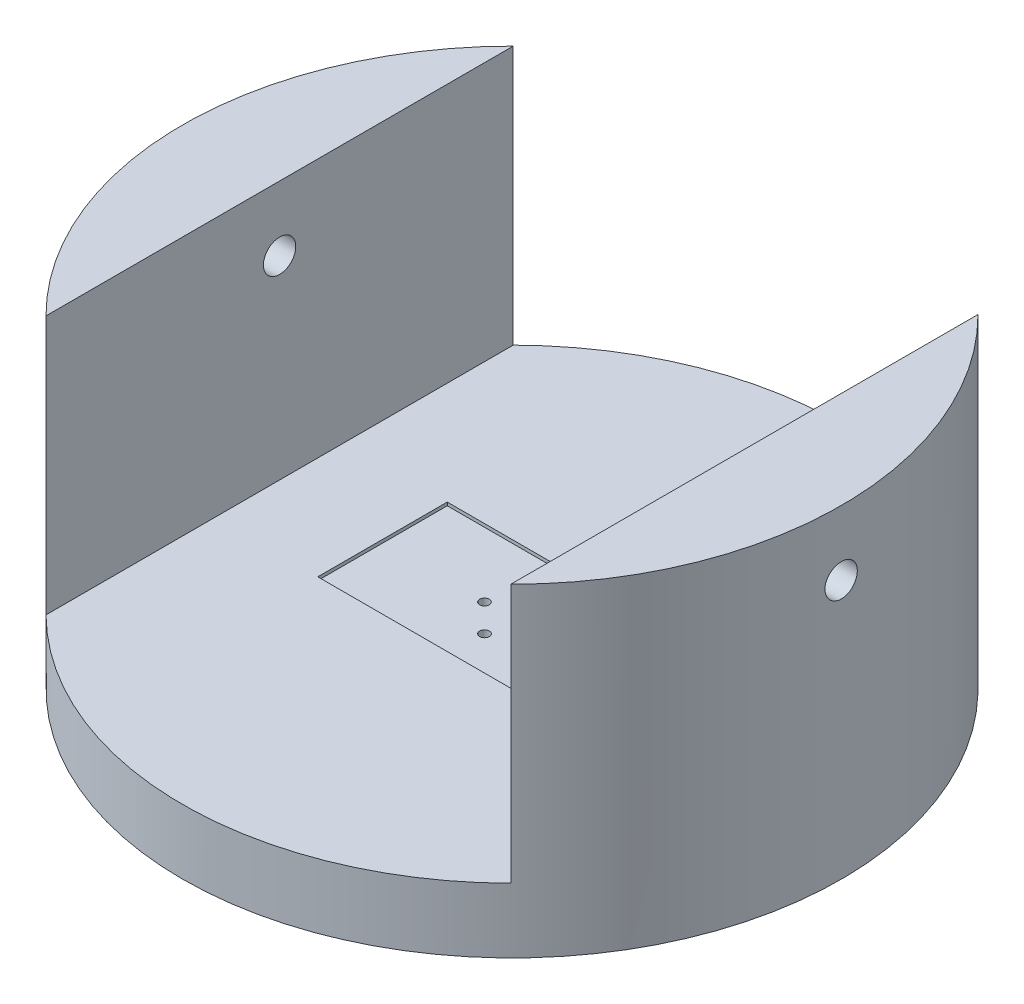
ISO-10303-21;
HEADER;
FILE_DESCRIPTION(('STEP AP214'),'2;1');
FILE_NAME('part.step','',(''),(''),'','','');
FILE_SCHEMA(('AUTOMOTIVE_DESIGN { 1 0 10303 214 1 1 1 1 }'));
ENDSEC;
DATA;
#1=APPLICATION_CONTEXT('core data for automotive mechanical design processes');
#2=APPLICATION_PROTOCOL_DEFINITION('international standard','automotive_design',2000,#1);
#3=PRODUCT_CONTEXT('',#1,'mechanical');
#4=PRODUCT('Part','Part','',(#3));
#5=PRODUCT_RELATED_PRODUCT_CATEGORY('part','',(#4));
#6=PRODUCT_DEFINITION_FORMATION('','',#4);
#7=PRODUCT_DEFINITION_CONTEXT('part definition',#1,'design');
#8=PRODUCT_DEFINITION('design','',#6,#7);
#9=PRODUCT_DEFINITION_SHAPE('','',#8);
#10=(LENGTH_UNIT() NAMED_UNIT(*) SI_UNIT(.MILLI.,.METRE.));
#11=(NAMED_UNIT(*) PLANE_ANGLE_UNIT() SI_UNIT($,.RADIAN.));
#12=(NAMED_UNIT(*) SI_UNIT($,.STERADIAN.) SOLID_ANGLE_UNIT());
#13=UNCERTAINTY_MEASURE_WITH_UNIT(LENGTH_MEASURE(1.E-05),#10,'distance_accuracy_value','');
#14=(GEOMETRIC_REPRESENTATION_CONTEXT(3) GLOBAL_UNCERTAINTY_ASSIGNED_CONTEXT((#13)) GLOBAL_UNIT_ASSIGNED_CONTEXT((#10,
#11,#12)) REPRESENTATION_CONTEXT('',''));
#15=CARTESIAN_POINT('',(0.,0.,0.));
#16=DIRECTION('',(0.,0.,1.));
#17=DIRECTION('',(1.,0.,0.));
#18=AXIS2_PLACEMENT_3D('',#15,#16,#17);
#19=CARTESIAN_POINT('',(0.,10.,0.));
#20=DIRECTION('',(0.,1.,0.));
#21=DIRECTION('',(0.,0.,1.));
#22=AXIS2_PLACEMENT_3D('',#19,#20,#21);
#23=PLANE('',#22);
#24=DIRECTION('',(0.,0.,1.));
#25=VECTOR('',#24,1.);
#26=CARTESIAN_POINT('',(-20.,10.,10.));
#27=LINE('',#26,#25);
#28=CARTESIAN_POINT('',(-20.,10.,-9.99999999999999));
#29=VERTEX_POINT('',#28);
#30=CARTESIAN_POINT('',(-20.,10.,10.));
#31=VERTEX_POINT('',#30);
#32=EDGE_CURVE('E62',#29,#31,#27,.T.);
#33=ORIENTED_EDGE('',*,*,#32,.F.);
#34=DIRECTION('',(-1.,0.,0.));
#35=VECTOR('',#34,1.);
#36=CARTESIAN_POINT('',(-20.,10.,-9.99999999999999));
#37=LINE('',#36,#35);
#38=CARTESIAN_POINT('',(20.,10.,-10.));
#39=VERTEX_POINT('',#38);
#40=EDGE_CURVE('E132',#39,#29,#37,.T.);
#41=ORIENTED_EDGE('',*,*,#40,.F.);
#42=DIRECTION('',(0.,0.,-1.));
#43=VECTOR('',#42,1.);
#44=CARTESIAN_POINT('',(20.,10.,-10.));
#45=LINE('',#44,#43);
#46=CARTESIAN_POINT('',(20.,10.,10.));
#47=VERTEX_POINT('',#46);
#48=EDGE_CURVE('E135',#47,#39,#45,.T.);
#49=ORIENTED_EDGE('',*,*,#48,.F.);
#50=DIRECTION('',(1.,0.,0.));
#51=VECTOR('',#50,1.);
#52=CARTESIAN_POINT('',(20.,10.,10.));
#53=LINE('',#52,#51);
#54=EDGE_CURVE('E148',#31,#47,#53,.T.);
#55=ORIENTED_EDGE('',*,*,#54,.F.);
#56=EDGE_LOOP('',(#33,#41,#49,#55));
#57=FACE_BOUND('',#56,.T.);
#58=CARTESIAN_POINT('',(0.,10.,0.));
#59=DIRECTION('',(0.,1.,0.));
#60=DIRECTION('',(0.,0.,1.));
#61=AXIS2_PLACEMENT_3D('',#58,#59,#60);
#62=CIRCLE('',#61,50.9);
#63=CARTESIAN_POINT('',(-35.9,10.,36.0832371053374));
#64=VERTEX_POINT('',#63);
#65=CARTESIAN_POINT('',(35.9,10.,36.0832371053374));
#66=VERTEX_POINT('',#65);
#67=EDGE_CURVE('E13',#64,#66,#62,.T.);
#68=ORIENTED_EDGE('',*,*,#67,.T.);
#69=DIRECTION('',(0.,0.,1.));
#70=VECTOR('',#69,1.);
#71=CARTESIAN_POINT('',(35.9,10.,-36.0832371053374));
#72=LINE('',#71,#70);
#73=CARTESIAN_POINT('',(35.9,10.,-36.0832371053374));
#74=VERTEX_POINT('',#73);
#75=EDGE_CURVE('E154',#74,#66,#72,.T.);
#76=ORIENTED_EDGE('',*,*,#75,.F.);
#77=CARTESIAN_POINT('',(-35.9,10.,-36.0832371053374));
#78=VERTEX_POINT('',#77);
#79=EDGE_CURVE('E54',#74,#78,#62,.T.);
#80=ORIENTED_EDGE('',*,*,#79,.T.);
#81=DIRECTION('',(0.,0.,-1.));
#82=VECTOR('',#81,1.);
#83=CARTESIAN_POINT('',(-35.9,10.,-36.0832371053374));
#84=LINE('',#83,#82);
#85=EDGE_CURVE('E168',#64,#78,#84,.T.);
#86=ORIENTED_EDGE('',*,*,#85,.F.);
#87=EDGE_LOOP('',(#68,#76,#80,#86));
#88=FACE_BOUND('',#87,.T.);
#89=ADVANCED_FACE('F44',(#57,#88),#23,.T.);
#90=CARTESIAN_POINT('',(0.,10.,0.));
#91=DIRECTION('',(0.,-1.,0.));
#92=DIRECTION('',(0.,0.,-1.));
#93=AXIS2_PLACEMENT_3D('',#90,#91,#92);
#94=CYLINDRICAL_SURFACE('',#93,50.9);
#95=CARTESIAN_POINT('',(50.9,37.5,0.));
#96=CARTESIAN_POINT('',(50.899999178288,37.5000061945284,0.140335315495875));
#97=CARTESIAN_POINT('',(50.8994134103271,37.5118560858074,0.280770230896745));
#98=CARTESIAN_POINT('',(50.8971329790787,37.5589597267073,0.55776618629829));
#99=CARTESIAN_POINT('',(50.8954370083023,37.5942410723297,0.694322460313293));
#100=CARTESIAN_POINT('',(50.8911281328147,37.6871952437949,0.959508478775688));
#101=CARTESIAN_POINT('',(50.8885156944419,37.7448566832624,1.08814221549268));
#102=CARTESIAN_POINT('',(50.8826681323159,37.8809168126421,1.33386985928264));
#103=CARTESIAN_POINT('',(50.8794331558784,37.9593105981527,1.45096648657076));
#104=CARTESIAN_POINT('',(50.8727009075915,38.1346957463511,1.67044562588503));
#105=CARTESIAN_POINT('',(50.869203413466,38.2317029798617,1.77281544976852));
#106=CARTESIAN_POINT('',(50.8623422368996,38.4415297624789,1.95982699405444));
#107=CARTESIAN_POINT('',(50.8589785599217,38.5543499562992,2.04446799127993));
#108=CARTESIAN_POINT('',(50.8527627656031,38.7926661665364,2.19365382762955));
#109=CARTESIAN_POINT('',(50.8499108992598,38.9181683554388,2.25818881790982));
#110=CARTESIAN_POINT('',(50.8450430142678,39.1782425471843,2.3652675243034));
#111=CARTESIAN_POINT('',(50.8430269894405,39.3128144829744,2.4078114029776));
#112=CARTESIAN_POINT('',(50.8400601281682,39.5870919771377,2.46966686111038));
#113=CARTESIAN_POINT('',(50.8391084252888,39.7267932640119,2.48899733889038));
#114=CARTESIAN_POINT('',(50.8383749272649,40.0074608495558,2.50393557912965));
#115=CARTESIAN_POINT('',(50.8385931231381,40.1484271385046,2.49954352372603));
#116=CARTESIAN_POINT('',(50.8401740116277,40.4274947746536,2.46717712116047));
#117=CARTESIAN_POINT('',(50.8415357133089,40.5655984963448,2.43922319208578));
#118=CARTESIAN_POINT('',(50.845248574059,40.8351508309038,2.3605581906664));
#119=CARTESIAN_POINT('',(50.8475997371996,40.9665994163822,2.30984702467215));
#120=CARTESIAN_POINT('',(50.853027663969,41.2191759176723,2.18708372784072));
#121=CARTESIAN_POINT('',(50.8561047440765,41.3402993005486,2.11502228537973));
#122=CARTESIAN_POINT('',(50.8626373612956,41.5687375641775,1.95161078383966));
#123=CARTESIAN_POINT('',(50.8660929009789,41.6760523510769,1.86026059367175));
#124=CARTESIAN_POINT('',(50.872997365203,41.8739459942041,1.66074945604258));
#125=CARTESIAN_POINT('',(50.8764462788778,41.9645070248656,1.55257082620293));
#126=CARTESIAN_POINT('',(50.8829452392278,42.1261851079459,1.32253575870044));
#127=CARTESIAN_POINT('',(50.8859952858071,42.1973021556894,1.20067931774873));
#128=CARTESIAN_POINT('',(50.8913528911502,42.3180717972252,0.946737284903343));
#129=CARTESIAN_POINT('',(50.8936604285125,42.3677237723377,0.814651398299533));
#130=CARTESIAN_POINT('',(50.8972726357233,42.4441421947544,0.544004523833167));
#131=CARTESIAN_POINT('',(50.8985773128176,42.4709088074095,0.405443582761672));
#132=CARTESIAN_POINT('',(50.9000358273666,42.5007747359253,0.125934593530665));
#133=CARTESIAN_POINT('',(50.9001908637601,42.5038987083246,-0.0150108140672829));
#134=CARTESIAN_POINT('',(50.8993358066533,42.4864550186276,-0.29542384877766));
#135=CARTESIAN_POINT('',(50.898325716869,42.4658874320928,-0.434891480601854));
#136=CARTESIAN_POINT('',(50.895254952083,42.401664870367,-0.708320917544246));
#137=CARTESIAN_POINT('',(50.8931947892422,42.3580211499043,-0.842285372384912));
#138=CARTESIAN_POINT('',(50.8882558356329,42.2488966157225,-1.10098730553627));
#139=CARTESIAN_POINT('',(50.8853770403188,42.1834156807464,-1.22572473260674));
#140=CARTESIAN_POINT('',(50.8791217098731,42.0324123335539,-1.4625450022472));
#141=CARTESIAN_POINT('',(50.8757447650221,41.9468733894934,-1.57461729266301));
#142=CARTESIAN_POINT('',(50.8688748257634,41.7582063209029,-1.78281987571597));
#143=CARTESIAN_POINT('',(50.8653818306358,41.6550780872696,-1.87895006945982));
#144=CARTESIAN_POINT('',(50.8586700744663,41.4340538232755,-2.05262265061835));
#145=CARTESIAN_POINT('',(50.8554515502621,41.3161452515169,-2.13014908762406));
#146=CARTESIAN_POINT('',(50.8496553919378,41.0689706998522,-2.26430445047674));
#147=CARTESIAN_POINT('',(50.8470777551016,40.939704768082,-2.32093346488818));
#148=CARTESIAN_POINT('',(50.8428557273101,40.673544026864,-2.41165867153619));
#149=CARTESIAN_POINT('',(50.8412109149174,40.5366526932185,-2.44576504034771));
#150=CARTESIAN_POINT('',(50.8390388284904,40.2590783228745,-2.49051008873807));
#151=CARTESIAN_POINT('',(50.8385115484061,40.1183953067072,-2.50114889536393));
#152=CARTESIAN_POINT('',(50.8386341379905,39.837389844152,-2.49865560768928));
#153=CARTESIAN_POINT('',(50.839282764967,39.6970671738715,-2.48554860783768));
#154=CARTESIAN_POINT('',(50.8416814372834,39.4206170817802,-2.43598762867176));
#155=CARTESIAN_POINT('',(50.8434314847278,39.2844896679865,-2.3995336047442));
#156=CARTESIAN_POINT('',(50.8478354746989,39.0202888675269,-2.30431845355329));
#157=CARTESIAN_POINT('',(50.8504894245008,38.8922155456951,-2.24555714674687));
#158=CARTESIAN_POINT('',(50.8564020098357,38.6477508769463,-2.10739987099319));
#159=CARTESIAN_POINT('',(50.8596606266338,38.531359168259,-2.02800454133867));
#160=CARTESIAN_POINT('',(50.8664191865589,38.3134365254526,-1.85074342741113));
#161=CARTESIAN_POINT('',(50.8699193553641,38.2119197730126,-1.75286021778541));
#162=CARTESIAN_POINT('',(50.876764964404,38.0267280661803,-1.54141207242487));
#163=CARTESIAN_POINT('',(50.8801103663485,37.9430575087482,-1.42784328339318));
#164=CARTESIAN_POINT('',(50.8862717104554,37.7958955493829,-1.18816111126337));
#165=CARTESIAN_POINT('',(50.889087151443,37.7324232097777,-1.06203602447497));
#166=CARTESIAN_POINT('',(50.8938637623272,37.6276310338376,-0.801000061070533));
#167=CARTESIAN_POINT('',(50.8958259412625,37.5862850182393,-0.666099780022183));
#168=CARTESIAN_POINT('',(50.8981556403198,37.5377704442036,-0.4419671524549));
#169=CARTESIAN_POINT('',(50.8988442377462,37.5236245962858,-0.354186725518144));
#170=CARTESIAN_POINT('',(50.8997666774609,37.504737417557,-0.177617500300308));
#171=CARTESIAN_POINT('',(50.9000005201229,37.4999960790203,-0.0888287028476507));
#172=CARTESIAN_POINT('',(50.9,37.5,0.));
#173=B_SPLINE_CURVE_WITH_KNOTS('',3,(#95,#96,#97,#98,#99,#100,#101,#102,#103,#104,#105,#106,
#107,#108,#109,#110,#111,#112,#113,#114,#115,#116,#117,#118,#119,#120,#121,#122,#123,#124,#125,
#126,#127,#128,#129,#130,#131,#132,#133,#134,#135,#136,#137,#138,#139,#140,#141,#142,#143,#144,
#145,#146,#147,#148,#149,#150,#151,#152,#153,#154,#155,#156,#157,#158,#159,#160,#161,#162,#163,
#164,#165,#166,#167,#168,#169,#170,#171,#172),.UNSPECIFIED.,.T.,.F.,(4,2,2,2,2,2,2,2,2,2,2,2,2,
2,2,2,2,2,2,2,2,2,2,2,2,2,2,2,2,2,2,2,2,2,2,2,2,2,4),(0.,0.420681689775843,0.841859711031153,
1.26282372881007,1.68368825313413,2.10491323668584,2.52615539909011,2.9476035819598,
3.36904864939046,3.79015037998689,4.21124887744889,4.63198283697985,5.0527185279122,
5.47363798761574,5.8945603080347,6.31592793517171,6.73729566362792,7.15867553619935,
7.58005236419971,8.00098968428222,8.42192566183705,8.84265652894807,9.26338973231761,
9.68447093115832,10.1055547419861,10.5269983001508,10.948440072193,11.3696912905263,
11.7909402283141,12.2117442519924,12.632549079777,13.0533572945356,13.4741524731757,
13.8953462604911,14.3166437023147,14.7383375778652,15.1595314073839,15.4258124883817,
15.692093350633),.UNSPECIFIED.);
#174=CARTESIAN_POINT('',(50.9,37.5,0.));
#175=VERTEX_POINT('',#174);
#176=EDGE_CURVE('E138',#175,#175,#173,.T.);
#177=ORIENTED_EDGE('',*,*,#176,.T.);
#178=EDGE_LOOP('',(#177));
#179=FACE_BOUND('',#178,.T.);
#180=CARTESIAN_POINT('',(-50.8385680364819,40.,2.5));
#181=CARTESIAN_POINT('',(-50.8385688619141,39.8596647996383,2.49999380536697));
#182=CARTESIAN_POINT('',(-50.8391553555019,39.719229998979,2.4881439328739));
#183=CARTESIAN_POINT('',(-50.8414383790576,39.4422342819935,2.44104037338173));
#184=CARTESIAN_POINT('',(-50.8431362178805,39.3056781317428,2.40575908999135));
#185=CARTESIAN_POINT('',(-50.8474491476851,39.0404923748944,2.31280510060348));
#186=CARTESIAN_POINT('',(-50.8500637720435,38.9118587749787,2.25514378395045));
#187=CARTESIAN_POINT('',(-50.8559150679424,38.6661313600612,2.11908394372054));
#188=CARTESIAN_POINT('',(-50.859151592327,38.5490348250178,2.0406903242404));
#189=CARTESIAN_POINT('',(-50.8658856296489,38.3295555801355,1.86530534316932));
#190=CARTESIAN_POINT('',(-50.8693833642523,38.2271855879932,1.76829807372093));
#191=CARTESIAN_POINT('',(-50.8762436010247,38.0401737193677,1.55847114877083));
#192=CARTESIAN_POINT('',(-50.8796060976767,37.9555325655461,1.44565084901232));
#193=CARTESIAN_POINT('',(-50.8858186224556,37.8063465665394,1.20733454735378));
#194=CARTESIAN_POINT('',(-50.8886683998857,37.7418115411318,1.08183239117292));
#195=CARTESIAN_POINT('',(-50.8935321196383,37.6347327607474,0.82175827058149));
#196=CARTESIAN_POINT('',(-50.8955460681232,37.5921888436357,0.687186373048127));
#197=CARTESIAN_POINT('',(-50.8985097024397,37.5303333035582,0.412908990337299));
#198=CARTESIAN_POINT('',(-50.8994602540816,37.5110027794651,0.273207777279604));
#199=CARTESIAN_POINT('',(-50.9001928786305,37.4960644210298,-0.00745966415324558));
#200=CARTESIAN_POINT('',(-50.8999749604847,37.5004564050393,-0.148425882833735));
#201=CARTESIAN_POINT('',(-50.8983959325729,37.5328226957588,-0.42749383702972));
#202=CARTESIAN_POINT('',(-50.8970358091285,37.5607766562165,-0.565597938655414));
#203=CARTESIAN_POINT('',(-50.8933267128996,37.6394418525637,-0.835151016920153));
#204=CARTESIAN_POINT('',(-50.8909777360761,37.6901531814035,-0.966599966374441));
#205=CARTESIAN_POINT('',(-50.8855538391901,37.8129168129539,-1.21917690425459));
#206=CARTESIAN_POINT('',(-50.8824786038039,37.8849783888869,-1.34030037843666));
#207=CARTESIAN_POINT('',(-50.875948522678,38.0483901739832,-1.56873876783677));
#208=CARTESIAN_POINT('',(-50.8724936743568,38.1397405143188,-1.67605358914184));
#209=CARTESIAN_POINT('',(-50.8655891435577,38.3392517570108,-1.87394705821838));
#210=CARTESIAN_POINT('',(-50.8621394703889,38.4474303114626,-1.96450791086828));
#211=CARTESIAN_POINT('',(-50.8556378649401,38.6774651652382,-2.12618567092248));
#212=CARTESIAN_POINT('',(-50.852585932763,38.7993214681021,-2.1973025732943));
#213=CARTESIAN_POINT('',(-50.8472242512466,39.0532634666557,-2.31807211077983));
#214=CARTESIAN_POINT('',(-50.8449145248713,39.1853494786963,-2.36772408178378));
#215=CARTESIAN_POINT('',(-50.8412986037421,39.455996625344,-2.44414245740849));
#216=CARTESIAN_POINT('',(-50.8399924017051,39.5945577129499,-2.47090902812242));
#217=CARTESIAN_POINT('',(-50.838532174105,39.8740667653657,-2.50077479894568));
#218=CARTESIAN_POINT('',(-50.8383769462724,40.0150120853414,-2.50389869548184));
#219=CARTESIAN_POINT('',(-50.8392330333581,40.2954249264732,-2.4864548853475));
#220=CARTESIAN_POINT('',(-50.8402443445563,40.4348924523406,-2.46588725423099));
#221=CARTESIAN_POINT('',(-50.8433184268664,40.7083213874026,-2.40166470965307));
#222=CARTESIAN_POINT('',(-50.84538068335,40.8422854568747,-2.35802109567891));
#223=CARTESIAN_POINT('',(-50.8503237813462,41.1009866665384,-2.24889690384843));
#224=CARTESIAN_POINT('',(-50.8532046274277,41.2257237552268,-2.18341620411296));
#225=CARTESIAN_POINT('',(-50.8594631303971,41.4625438020073,-2.0324131987815));
#226=CARTESIAN_POINT('',(-50.8628411977097,41.5746161697709,-1.94687430148595));
#227=CARTESIAN_POINT('',(-50.8697119525461,41.7828189307328,-1.75820728275871));
#228=CARTESIAN_POINT('',(-50.8732046407784,41.8789492253676,-1.65507905258713));
#229=CARTESIAN_POINT('',(-50.8799144876398,42.0526220135938,-1.43405474299083));
#230=CARTESIAN_POINT('',(-50.8831314083196,42.130148556443,-1.31614612186074));
#231=CARTESIAN_POINT('',(-50.8889237650071,42.264304105238,-1.06897144426609));
#232=CARTESIAN_POINT('',(-50.8914992037335,42.3209331997533,-0.939705435940266));
#233=CARTESIAN_POINT('',(-50.8957172030836,42.4116584618471,-0.673544751947019));
#234=CARTESIAN_POINT('',(-50.8973601864107,42.4457648406416,-0.536653563905589));
#235=CARTESIAN_POINT('',(-50.8995297901121,42.4905099583741,-0.259079499756969));
#236=CARTESIAN_POINT('',(-50.9000564164935,42.5011488235885,-0.118396644056491));
#237=CARTESIAN_POINT('',(-50.8999339827891,42.4986557021379,0.162608927886482));
#238=CARTESIAN_POINT('',(-50.8992861604046,42.4855487401911,0.302931867381018));
#239=CARTESIAN_POINT('',(-50.8968901987568,42.435987741906,0.579382507084282));
#240=CARTESIAN_POINT('',(-50.8951420574138,42.3995336614374,0.715510199362732));
#241=CARTESIAN_POINT('',(-50.8907421468803,42.3043182973011,0.979711541377468));
#242=CARTESIAN_POINT('',(-50.8880903704119,42.2455568339656,1.10778512623487));
#243=CARTESIAN_POINT('',(-50.8821814476901,42.1073991641146,1.35225025538102));
#244=CARTESIAN_POINT('',(-50.878924320201,42.028003597176,1.46864216160141));
#245=CARTESIAN_POINT('',(-50.8721674145165,41.8507422274803,1.68656478043904));
#246=CARTESIAN_POINT('',(-50.8686674100798,41.7528590532597,1.7880813551716));
#247=CARTESIAN_POINT('',(-50.8618207217253,41.5414110510904,1.97327272005739));
#248=CARTESIAN_POINT('',(-50.8584740757552,41.42784236946,2.05694311279274));
#249=CARTESIAN_POINT('',(-50.8523093735175,41.1881602795019,2.20410490082794));
#250=CARTESIAN_POINT('',(-50.849491818431,41.0620351483677,2.26757720262708));
#251=CARTESIAN_POINT('',(-50.8447110477833,40.8009990898838,2.3723692954851));
#252=CARTESIAN_POINT('',(-50.8427468230828,40.6660987583502,2.41371526639934));
#253=CARTESIAN_POINT('',(-50.8404145659926,40.4419662509278,2.46222971071387));
#254=CARTESIAN_POINT('',(-50.8397251687866,40.3541860037853,2.47637550035938));
#255=CARTESIAN_POINT('',(-50.8388016429805,40.1776171390258,2.49526260164446));
#256=CARTESIAN_POINT('',(-50.8385675140048,40.0888285222406,2.50000392104117));
#257=CARTESIAN_POINT('',(-50.8385680364819,40.,2.5));
#258=B_SPLINE_CURVE_WITH_KNOTS('',3,(#180,#181,#182,#183,#184,#185,#186,#187,#188,#189,#190,
#191,#192,#193,#194,#195,#196,#197,#198,#199,#200,#201,#202,#203,#204,#205,#206,#207,#208,#209,
#210,#211,#212,#213,#214,#215,#216,#217,#218,#219,#220,#221,#222,#223,#224,#225,#226,#227,#228,
#229,#230,#231,#232,#233,#234,#235,#236,#237,#238,#239,#240,#241,#242,#243,#244,#245,#246,#247,
#248,#249,#250,#251,#252,#253,#254,#255,#256,#257),.UNSPECIFIED.,.T.,.F.,(4,2,2,2,2,2,2,2,2,2,2,
2,2,2,2,2,2,2,2,2,2,2,2,2,2,2,2,2,2,2,2,2,2,2,2,2,2,2,4),(0.,0.420681344000615,
0.841859027018842,1.26282265042108,1.6836867864336,2.10491222230972,2.5261548248054,
2.94760283967315,3.3690477472653,3.79014926702614,4.21124756232848,4.63198260266036,
5.05271936145886,5.47363913076151,5.89456176259848,6.31592893964616,6.73729622575156,
7.15867654772907,7.58005381146897,8.00099085635381,8.42192655884392,8.84265633473323,
9.26338845887776,9.68446983873335,10.1055538218715,10.5269975600752,10.9484395120589,
11.3696902617579,11.7909387447428,12.2117435500623,12.6325491507805,13.0533581408129,
13.4741540889574,13.8953474134827,14.3166444032507,14.7383384751824,15.159532489674,
15.4258130297548,15.6920933501979),.UNSPECIFIED.);
#259=CARTESIAN_POINT('',(-50.8385680364819,40.,2.5));
#260=VERTEX_POINT('',#259);
#261=EDGE_CURVE('E212',#260,#260,#258,.T.);
#262=ORIENTED_EDGE('',*,*,#261,.T.);
#263=EDGE_LOOP('',(#262));
#264=FACE_BOUND('',#263,.T.);
#265=ORIENTED_EDGE('',*,*,#67,.F.);
#266=DIRECTION('',(0.,-1.,0.));
#267=VECTOR('',#266,1.);
#268=CARTESIAN_POINT('',(-35.9,50.,36.0832371053374));
#269=LINE('',#268,#267);
#270=CARTESIAN_POINT('',(-35.9,50.,36.0832371053374));
#271=VERTEX_POINT('',#270);
#272=EDGE_CURVE('E179',#271,#64,#269,.T.);
#273=ORIENTED_EDGE('',*,*,#272,.F.);
#274=CARTESIAN_POINT('',(0.,50.,0.));
#275=DIRECTION('',(0.,1.,0.));
#276=DIRECTION('',(0.,0.,1.));
#277=AXIS2_PLACEMENT_3D('',#274,#275,#276);
#278=CIRCLE('',#277,50.9);
#279=CARTESIAN_POINT('',(-35.9,50.,-36.0832371053374));
#280=VERTEX_POINT('',#279);
#281=EDGE_CURVE('E169',#280,#271,#278,.T.);
#282=ORIENTED_EDGE('',*,*,#281,.F.);
#283=DIRECTION('',(0.,-1.,0.));
#284=VECTOR('',#283,1.);
#285=CARTESIAN_POINT('',(-35.9,50.,-36.0832371053374));
#286=LINE('',#285,#284);
#287=EDGE_CURVE('E174',#280,#78,#286,.T.);
#288=ORIENTED_EDGE('',*,*,#287,.T.);
#289=ORIENTED_EDGE('',*,*,#79,.F.);
#290=DIRECTION('',(0.,-1.,0.));
#291=VECTOR('',#290,1.);
#292=CARTESIAN_POINT('',(35.9,50.,-36.0832371053374));
#293=LINE('',#292,#291);
#294=CARTESIAN_POINT('',(35.9,50.,-36.0832371053374));
#295=VERTEX_POINT('',#294);
#296=EDGE_CURVE('E70',#295,#74,#293,.T.);
#297=ORIENTED_EDGE('',*,*,#296,.F.);
#298=CARTESIAN_POINT('',(0.,50.,0.));
#299=DIRECTION('',(0.,1.,0.));
#300=DIRECTION('',(0.,0.,-1.));
#301=AXIS2_PLACEMENT_3D('',#298,#299,#300);
#302=CIRCLE('',#301,50.9);
#303=CARTESIAN_POINT('',(35.9,50.,36.0832371053374));
#304=VERTEX_POINT('',#303);
#305=EDGE_CURVE('E158',#304,#295,#302,.T.);
#306=ORIENTED_EDGE('',*,*,#305,.F.);
#307=DIRECTION('',(0.,-1.,0.));
#308=VECTOR('',#307,1.);
#309=CARTESIAN_POINT('',(35.9,50.,36.0832371053374));
#310=LINE('',#309,#308);
#311=EDGE_CURVE('E163',#304,#66,#310,.T.);
#312=ORIENTED_EDGE('',*,*,#311,.T.);
#313=EDGE_LOOP('',(#265,#273,#282,#288,#289,#297,#306,#312));
#314=FACE_BOUND('',#313,.T.);
#315=CARTESIAN_POINT('',(0.,0.,0.));
#316=DIRECTION('',(0.,1.,0.));
#317=DIRECTION('',(0.,0.,1.));
#318=AXIS2_PLACEMENT_3D('',#315,#316,#317);
#319=CIRCLE('',#318,50.9);
#320=CARTESIAN_POINT('',(0.,0.,50.9));
#321=VERTEX_POINT('',#320);
#322=EDGE_CURVE('E181',#321,#321,#319,.T.);
#323=ORIENTED_EDGE('',*,*,#322,.T.);
#324=EDGE_LOOP('',(#323));
#325=FACE_BOUND('',#324,.T.);
#326=ADVANCED_FACE('F46',(#179,#264,#314,#325),#94,.T.);
#327=CARTESIAN_POINT('',(0.,0.,0.));
#328=DIRECTION('',(0.,1.,0.));
#329=DIRECTION('',(0.,0.,1.));
#330=AXIS2_PLACEMENT_3D('',#327,#328,#329);
#331=PLANE('',#330);
#332=CARTESIAN_POINT('',(0.,0.,4.25));
#333=DIRECTION('',(0.,-1.,0.));
#334=DIRECTION('',(0.,0.,-1.));
#335=AXIS2_PLACEMENT_3D('',#332,#333,#334);
#336=CIRCLE('',#335,0.75);
#337=CARTESIAN_POINT('',(0.,0.,3.5));
#338=VERTEX_POINT('',#337);
#339=EDGE_CURVE('E196',#338,#338,#336,.T.);
#340=ORIENTED_EDGE('',*,*,#339,.F.);
#341=EDGE_LOOP('',(#340));
#342=FACE_BOUND('',#341,.T.);
#343=CARTESIAN_POINT('',(4.25,0.,0.));
#344=DIRECTION('',(0.,-1.,0.));
#345=DIRECTION('',(0.,0.,-1.));
#346=AXIS2_PLACEMENT_3D('',#343,#344,#345);
#347=CIRCLE('',#346,0.75);
#348=CARTESIAN_POINT('',(4.25,0.,-0.75));
#349=VERTEX_POINT('',#348);
#350=EDGE_CURVE('E272',#349,#349,#347,.T.);
#351=ORIENTED_EDGE('',*,*,#350,.F.);
#352=EDGE_LOOP('',(#351));
#353=FACE_BOUND('',#352,.T.);
#354=CARTESIAN_POINT('',(0.,0.,-4.25));
#355=DIRECTION('',(0.,-1.,0.));
#356=DIRECTION('',(0.,0.,-1.));
#357=AXIS2_PLACEMENT_3D('',#354,#355,#356);
#358=CIRCLE('',#357,0.75);
#359=CARTESIAN_POINT('',(0.,0.,-5.));
#360=VERTEX_POINT('',#359);
#361=EDGE_CURVE('E209',#360,#360,#358,.T.);
#362=ORIENTED_EDGE('',*,*,#361,.F.);
#363=EDGE_LOOP('',(#362));
#364=FACE_BOUND('',#363,.T.);
#365=CARTESIAN_POINT('',(-4.25,0.,0.));
#366=DIRECTION('',(0.,-1.,0.));
#367=DIRECTION('',(0.,0.,-1.));
#368=AXIS2_PLACEMENT_3D('',#365,#366,#367);
#369=CIRCLE('',#368,0.75);
#370=CARTESIAN_POINT('',(-4.25,0.,-0.75));
#371=VERTEX_POINT('',#370);
#372=EDGE_CURVE('E192',#371,#371,#369,.T.);
#373=ORIENTED_EDGE('',*,*,#372,.F.);
#374=EDGE_LOOP('',(#373));
#375=FACE_BOUND('',#374,.T.);
#376=ORIENTED_EDGE('',*,*,#322,.F.);
#377=EDGE_LOOP('',(#376));
#378=FACE_BOUND('',#377,.T.);
#379=ADVANCED_FACE('F256',(#342,#353,#364,#375,#378),#331,.F.);
#380=CARTESIAN_POINT('',(-35.9,50.,-36.0832371053374));
#381=DIRECTION('',(-1.,0.,0.));
#382=DIRECTION('',(0.,0.,1.));
#383=AXIS2_PLACEMENT_3D('',#380,#381,#382);
#384=PLANE('',#383);
#385=CARTESIAN_POINT('',(-35.9,40.,0.));
#386=DIRECTION('',(-1.,0.,0.));
#387=DIRECTION('',(0.,0.,1.));
#388=AXIS2_PLACEMENT_3D('',#385,#386,#387);
#389=CIRCLE('',#388,2.5);
#390=CARTESIAN_POINT('',(-35.9,40.,2.5));
#391=VERTEX_POINT('',#390);
#392=EDGE_CURVE('E188',#391,#391,#389,.T.);
#393=ORIENTED_EDGE('',*,*,#392,.T.);
#394=EDGE_LOOP('',(#393));
#395=FACE_BOUND('',#394,.T.);
#396=ORIENTED_EDGE('',*,*,#85,.T.);
#397=ORIENTED_EDGE('',*,*,#287,.F.);
#398=DIRECTION('',(0.,0.,-1.));
#399=VECTOR('',#398,1.);
#400=CARTESIAN_POINT('',(-35.9,50.,-36.0832371053374));
#401=LINE('',#400,#399);
#402=EDGE_CURVE('E172',#271,#280,#401,.T.);
#403=ORIENTED_EDGE('',*,*,#402,.F.);
#404=ORIENTED_EDGE('',*,*,#272,.T.);
#405=EDGE_LOOP('',(#396,#397,#403,#404));
#406=FACE_BOUND('',#405,.T.);
#407=ADVANCED_FACE('F252',(#395,#406),#384,.F.);
#408=CARTESIAN_POINT('',(0.,50.,0.));
#409=DIRECTION('',(0.,1.,0.));
#410=DIRECTION('',(0.,0.,1.));
#411=AXIS2_PLACEMENT_3D('',#408,#409,#410);
#412=PLANE('',#411);
#413=ORIENTED_EDGE('',*,*,#281,.T.);
#414=ORIENTED_EDGE('',*,*,#402,.T.);
#415=EDGE_LOOP('',(#413,#414));
#416=FACE_BOUND('',#415,.T.);
#417=ADVANCED_FACE('F248',(#416),#412,.T.);
#418=CARTESIAN_POINT('',(35.9,50.,-36.0832371053374));
#419=DIRECTION('',(1.,0.,0.));
#420=DIRECTION('',(0.,0.,-1.));
#421=AXIS2_PLACEMENT_3D('',#418,#419,#420);
#422=PLANE('',#421);
#423=CARTESIAN_POINT('',(35.9,40.,0.));
#424=DIRECTION('',(1.,0.,0.));
#425=DIRECTION('',(0.,0.,-1.));
#426=AXIS2_PLACEMENT_3D('',#423,#424,#425);
#427=CIRCLE('',#426,2.5);
#428=CARTESIAN_POINT('',(35.9,40.,-2.5));
#429=VERTEX_POINT('',#428);
#430=EDGE_CURVE('E185',#429,#429,#427,.T.);
#431=ORIENTED_EDGE('',*,*,#430,.T.);
#432=EDGE_LOOP('',(#431));
#433=FACE_BOUND('',#432,.T.);
#434=ORIENTED_EDGE('',*,*,#75,.T.);
#435=ORIENTED_EDGE('',*,*,#311,.F.);
#436=DIRECTION('',(0.,0.,1.));
#437=VECTOR('',#436,1.);
#438=CARTESIAN_POINT('',(35.9,50.,-36.0832371053374));
#439=LINE('',#438,#437);
#440=EDGE_CURVE('E161',#295,#304,#439,.T.);
#441=ORIENTED_EDGE('',*,*,#440,.F.);
#442=ORIENTED_EDGE('',*,*,#296,.T.);
#443=EDGE_LOOP('',(#434,#435,#441,#442));
#444=FACE_BOUND('',#443,.T.);
#445=ADVANCED_FACE('F244',(#433,#444),#422,.F.);
#446=CARTESIAN_POINT('',(0.,50.,0.));
#447=DIRECTION('',(0.,-1.,0.));
#448=DIRECTION('',(0.,0.,-1.));
#449=AXIS2_PLACEMENT_3D('',#446,#447,#448);
#450=PLANE('',#449);
#451=ORIENTED_EDGE('',*,*,#305,.T.);
#452=ORIENTED_EDGE('',*,*,#440,.T.);
#453=EDGE_LOOP('',(#451,#452));
#454=FACE_BOUND('',#453,.T.);
#455=ADVANCED_FACE('F241',(#454),#450,.F.);
#456=CARTESIAN_POINT('',(-20.,9.5,10.));
#457=DIRECTION('',(-1.,0.,0.));
#458=DIRECTION('',(0.,0.,1.));
#459=AXIS2_PLACEMENT_3D('',#456,#457,#458);
#460=PLANE('',#459);
#461=ORIENTED_EDGE('',*,*,#32,.T.);
#462=DIRECTION('',(0.,1.,0.));
#463=VECTOR('',#462,1.);
#464=CARTESIAN_POINT('',(-20.,9.5,10.));
#465=LINE('',#464,#463);
#466=CARTESIAN_POINT('',(-20.,9.5,10.));
#467=VERTEX_POINT('',#466);
#468=EDGE_CURVE('E110',#467,#31,#465,.T.);
#469=ORIENTED_EDGE('',*,*,#468,.F.);
#470=DIRECTION('',(0.,0.,1.));
#471=VECTOR('',#470,1.);
#472=CARTESIAN_POINT('',(-20.,9.5,10.));
#473=LINE('',#472,#471);
#474=CARTESIAN_POINT('',(-20.,9.5,-9.99999999999999));
#475=VERTEX_POINT('',#474);
#476=EDGE_CURVE('E114',#475,#467,#473,.T.);
#477=ORIENTED_EDGE('',*,*,#476,.F.);
#478=DIRECTION('',(0.,1.,0.));
#479=VECTOR('',#478,1.);
#480=CARTESIAN_POINT('',(-20.,9.5,-9.99999999999999));
#481=LINE('',#480,#479);
#482=EDGE_CURVE('E152',#475,#29,#481,.T.);
#483=ORIENTED_EDGE('',*,*,#482,.T.);
#484=EDGE_LOOP('',(#461,#469,#477,#483));
#485=FACE_BOUND('',#484,.T.);
#486=ADVANCED_FACE('F112',(#485),#460,.F.);
#487=CARTESIAN_POINT('',(-20.,9.5,-9.99999999999999));
#488=DIRECTION('',(0.,0.,-1.));
#489=DIRECTION('',(-1.,0.,0.));
#490=AXIS2_PLACEMENT_3D('',#487,#488,#489);
#491=PLANE('',#490);
#492=ORIENTED_EDGE('',*,*,#40,.T.);
#493=ORIENTED_EDGE('',*,*,#482,.F.);
#494=DIRECTION('',(-1.,0.,0.));
#495=VECTOR('',#494,1.);
#496=CARTESIAN_POINT('',(-20.,9.5,-9.99999999999999));
#497=LINE('',#496,#495);
#498=CARTESIAN_POINT('',(20.,9.5,-10.));
#499=VERTEX_POINT('',#498);
#500=EDGE_CURVE('E120',#499,#475,#497,.T.);
#501=ORIENTED_EDGE('',*,*,#500,.F.);
#502=DIRECTION('',(0.,1.,0.));
#503=VECTOR('',#502,1.);
#504=CARTESIAN_POINT('',(20.,9.5,-10.));
#505=LINE('',#504,#503);
#506=EDGE_CURVE('E155',#499,#39,#505,.T.);
#507=ORIENTED_EDGE('',*,*,#506,.T.);
#508=EDGE_LOOP('',(#492,#493,#501,#507));
#509=FACE_BOUND('',#508,.T.);
#510=ADVANCED_FACE('F229',(#509),#491,.F.);
#511=CARTESIAN_POINT('',(20.,9.5,-10.));
#512=DIRECTION('',(1.,0.,0.));
#513=DIRECTION('',(0.,0.,-1.));
#514=AXIS2_PLACEMENT_3D('',#511,#512,#513);
#515=PLANE('',#514);
#516=ORIENTED_EDGE('',*,*,#48,.T.);
#517=ORIENTED_EDGE('',*,*,#506,.F.);
#518=DIRECTION('',(0.,0.,-1.));
#519=VECTOR('',#518,1.);
#520=CARTESIAN_POINT('',(20.,9.5,-10.));
#521=LINE('',#520,#519);
#522=CARTESIAN_POINT('',(20.,9.5,10.));
#523=VERTEX_POINT('',#522);
#524=EDGE_CURVE('E128',#523,#499,#521,.T.);
#525=ORIENTED_EDGE('',*,*,#524,.F.);
#526=DIRECTION('',(0.,1.,0.));
#527=VECTOR('',#526,1.);
#528=CARTESIAN_POINT('',(20.,9.5,10.));
#529=LINE('',#528,#527);
#530=EDGE_CURVE('E119',#523,#47,#529,.T.);
#531=ORIENTED_EDGE('',*,*,#530,.T.);
#532=EDGE_LOOP('',(#516,#517,#525,#531));
#533=FACE_BOUND('',#532,.T.);
#534=ADVANCED_FACE('F232',(#533),#515,.F.);
#535=CARTESIAN_POINT('',(20.,9.5,10.));
#536=DIRECTION('',(0.,0.,1.));
#537=DIRECTION('',(1.,0.,0.));
#538=AXIS2_PLACEMENT_3D('',#535,#536,#537);
#539=PLANE('',#538);
#540=ORIENTED_EDGE('',*,*,#54,.T.);
#541=ORIENTED_EDGE('',*,*,#530,.F.);
#542=DIRECTION('',(1.,0.,0.));
#543=VECTOR('',#542,1.);
#544=CARTESIAN_POINT('',(20.,9.5,10.));
#545=LINE('',#544,#543);
#546=EDGE_CURVE('E123',#467,#523,#545,.T.);
#547=ORIENTED_EDGE('',*,*,#546,.F.);
#548=ORIENTED_EDGE('',*,*,#468,.T.);
#549=EDGE_LOOP('',(#540,#541,#547,#548));
#550=FACE_BOUND('',#549,.T.);
#551=ADVANCED_FACE('F124',(#550),#539,.F.);
#552=CARTESIAN_POINT('',(0.,9.5,0.));
#553=DIRECTION('',(0.,-1.,0.));
#554=DIRECTION('',(0.,0.,-1.));
#555=AXIS2_PLACEMENT_3D('',#552,#553,#554);
#556=PLANE('',#555);
#557=CARTESIAN_POINT('',(0.,9.5,4.25));
#558=DIRECTION('',(0.,-1.,0.));
#559=DIRECTION('',(0.,0.,-1.));
#560=AXIS2_PLACEMENT_3D('',#557,#558,#559);
#561=CIRCLE('',#560,0.75);
#562=CARTESIAN_POINT('',(0.,9.5,3.5));
#563=VERTEX_POINT('',#562);
#564=EDGE_CURVE('E49',#563,#563,#561,.T.);
#565=ORIENTED_EDGE('',*,*,#564,.T.);
#566=EDGE_LOOP('',(#565));
#567=FACE_BOUND('',#566,.T.);
#568=CARTESIAN_POINT('',(4.25,9.5,0.));
#569=DIRECTION('',(0.,-1.,0.));
#570=DIRECTION('',(0.,0.,-1.));
#571=AXIS2_PLACEMENT_3D('',#568,#569,#570);
#572=CIRCLE('',#571,0.75);
#573=CARTESIAN_POINT('',(4.25,9.5,-0.75));
#574=VERTEX_POINT('',#573);
#575=EDGE_CURVE('E195',#574,#574,#572,.T.);
#576=ORIENTED_EDGE('',*,*,#575,.T.);
#577=EDGE_LOOP('',(#576));
#578=FACE_BOUND('',#577,.T.);
#579=CARTESIAN_POINT('',(0.,9.5,-4.25));
#580=DIRECTION('',(0.,-1.,0.));
#581=DIRECTION('',(0.,0.,-1.));
#582=AXIS2_PLACEMENT_3D('',#579,#580,#581);
#583=CIRCLE('',#582,0.75);
#584=CARTESIAN_POINT('',(0.,9.5,-5.));
#585=VERTEX_POINT('',#584);
#586=EDGE_CURVE('E193',#585,#585,#583,.T.);
#587=ORIENTED_EDGE('',*,*,#586,.T.);
#588=EDGE_LOOP('',(#587));
#589=FACE_BOUND('',#588,.T.);
#590=CARTESIAN_POINT('',(-4.25,9.5,0.));
#591=DIRECTION('',(0.,-1.,0.));
#592=DIRECTION('',(0.,0.,-1.));
#593=AXIS2_PLACEMENT_3D('',#590,#591,#592);
#594=CIRCLE('',#593,0.75);
#595=CARTESIAN_POINT('',(-4.25,9.5,-0.75));
#596=VERTEX_POINT('',#595);
#597=EDGE_CURVE('E189',#596,#596,#594,.T.);
#598=ORIENTED_EDGE('',*,*,#597,.T.);
#599=EDGE_LOOP('',(#598));
#600=FACE_BOUND('',#599,.T.);
#601=ORIENTED_EDGE('',*,*,#476,.T.);
#602=ORIENTED_EDGE('',*,*,#546,.T.);
#603=ORIENTED_EDGE('',*,*,#524,.T.);
#604=ORIENTED_EDGE('',*,*,#500,.T.);
#605=EDGE_LOOP('',(#601,#602,#603,#604));
#606=FACE_BOUND('',#605,.T.);
#607=ADVANCED_FACE('F130',(#567,#578,#589,#600,#606),#556,.F.);
#608=CARTESIAN_POINT('',(50.9,40.,0.));
#609=DIRECTION('',(-1.,0.,0.));
#610=DIRECTION('',(0.,0.,1.));
#611=AXIS2_PLACEMENT_3D('',#608,#609,#610);
#612=CYLINDRICAL_SURFACE('',#611,2.5);
#613=ORIENTED_EDGE('',*,*,#430,.F.);
#614=EDGE_LOOP('',(#613));
#615=FACE_BOUND('',#614,.T.);
#616=ORIENTED_EDGE('',*,*,#176,.F.);
#617=EDGE_LOOP('',(#616));
#618=FACE_BOUND('',#617,.T.);
#619=ADVANCED_FACE('F217',(#615,#618),#612,.F.);
#620=ORIENTED_EDGE('',*,*,#392,.F.);
#621=EDGE_LOOP('',(#620));
#622=FACE_BOUND('',#621,.T.);
#623=ORIENTED_EDGE('',*,*,#261,.F.);
#624=EDGE_LOOP('',(#623));
#625=FACE_BOUND('',#624,.T.);
#626=ADVANCED_FACE('F222',(#622,#625),#612,.F.);
#627=CARTESIAN_POINT('',(-4.25,50.,0.));
#628=DIRECTION('',(0.,-1.,0.));
#629=DIRECTION('',(0.,0.,-1.));
#630=AXIS2_PLACEMENT_3D('',#627,#628,#629);
#631=CYLINDRICAL_SURFACE('',#630,0.75);
#632=ORIENTED_EDGE('',*,*,#372,.T.);
#633=EDGE_LOOP('',(#632));
#634=FACE_BOUND('',#633,.T.);
#635=ORIENTED_EDGE('',*,*,#597,.F.);
#636=EDGE_LOOP('',(#635));
#637=FACE_BOUND('',#636,.T.);
#638=ADVANCED_FACE('F224',(#634,#637),#631,.F.);
#639=CARTESIAN_POINT('',(0.,50.,-4.25));
#640=DIRECTION('',(0.,-1.,0.));
#641=DIRECTION('',(0.,0.,-1.));
#642=AXIS2_PLACEMENT_3D('',#639,#640,#641);
#643=CYLINDRICAL_SURFACE('',#642,0.75);
#644=ORIENTED_EDGE('',*,*,#361,.T.);
#645=EDGE_LOOP('',(#644));
#646=FACE_BOUND('',#645,.T.);
#647=ORIENTED_EDGE('',*,*,#586,.F.);
#648=EDGE_LOOP('',(#647));
#649=FACE_BOUND('',#648,.T.);
#650=ADVANCED_FACE('F291',(#646,#649),#643,.F.);
#651=CARTESIAN_POINT('',(4.25,50.,0.));
#652=DIRECTION('',(0.,-1.,0.));
#653=DIRECTION('',(0.,0.,-1.));
#654=AXIS2_PLACEMENT_3D('',#651,#652,#653);
#655=CYLINDRICAL_SURFACE('',#654,0.75);
#656=ORIENTED_EDGE('',*,*,#350,.T.);
#657=EDGE_LOOP('',(#656));
#658=FACE_BOUND('',#657,.T.);
#659=ORIENTED_EDGE('',*,*,#575,.F.);
#660=EDGE_LOOP('',(#659));
#661=FACE_BOUND('',#660,.T.);
#662=ADVANCED_FACE('F286',(#658,#661),#655,.F.);
#663=CARTESIAN_POINT('',(0.,50.,4.25));
#664=DIRECTION('',(0.,-1.,0.));
#665=DIRECTION('',(0.,0.,-1.));
#666=AXIS2_PLACEMENT_3D('',#663,#664,#665);
#667=CYLINDRICAL_SURFACE('',#666,0.75);
#668=ORIENTED_EDGE('',*,*,#339,.T.);
#669=EDGE_LOOP('',(#668));
#670=FACE_BOUND('',#669,.T.);
#671=ORIENTED_EDGE('',*,*,#564,.F.);
#672=EDGE_LOOP('',(#671));
#673=FACE_BOUND('',#672,.T.);
#674=ADVANCED_FACE('F283',(#670,#673),#667,.F.);
#675=CLOSED_SHELL('',(#89,#326,#379,#407,#417,#445,#455,#486,#510,#534,#551,#607,#619,#626,#638,
#650,#662,#674));
#676=MANIFOLD_SOLID_BREP('B2',#675);
#677=ADVANCED_BREP_SHAPE_REPRESENTATION('',(#18,#676),#14);
#678=SHAPE_DEFINITION_REPRESENTATION(#9,#677);
ENDSEC;
END-ISO-10303-21;
